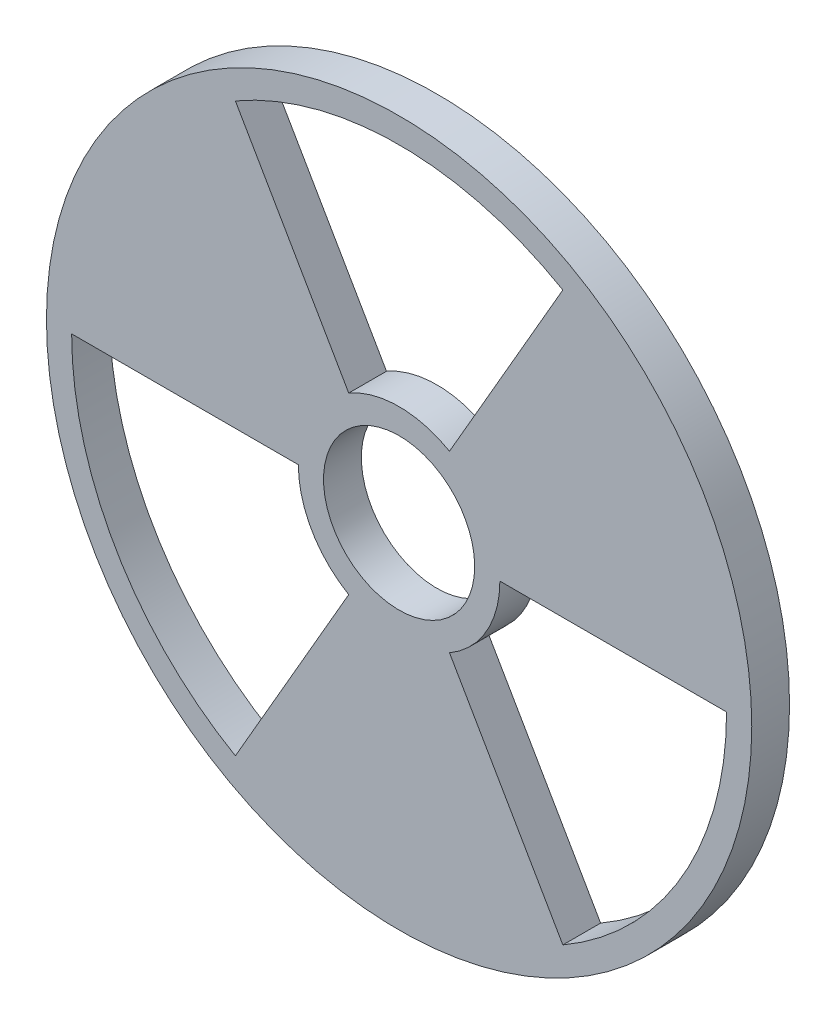
ISO-10303-21;
HEADER;
FILE_DESCRIPTION(('STEP AP214'),'2;1');
FILE_NAME('part.step','',(''),(''),'','','');
FILE_SCHEMA(('AUTOMOTIVE_DESIGN { 1 0 10303 214 1 1 1 1 }'));
ENDSEC;
DATA;
#1=APPLICATION_CONTEXT('core data for automotive mechanical design processes');
#2=APPLICATION_PROTOCOL_DEFINITION('international standard','automotive_design',2000,#1);
#3=PRODUCT_CONTEXT('',#1,'mechanical');
#4=PRODUCT('Part','Part','',(#3));
#5=PRODUCT_RELATED_PRODUCT_CATEGORY('part','',(#4));
#6=PRODUCT_DEFINITION_FORMATION('','',#4);
#7=PRODUCT_DEFINITION_CONTEXT('part definition',#1,'design');
#8=PRODUCT_DEFINITION('design','',#6,#7);
#9=PRODUCT_DEFINITION_SHAPE('','',#8);
#10=(LENGTH_UNIT() NAMED_UNIT(*) SI_UNIT(.MILLI.,.METRE.));
#11=(NAMED_UNIT(*) PLANE_ANGLE_UNIT() SI_UNIT($,.RADIAN.));
#12=(NAMED_UNIT(*) SI_UNIT($,.STERADIAN.) SOLID_ANGLE_UNIT());
#13=UNCERTAINTY_MEASURE_WITH_UNIT(LENGTH_MEASURE(1.E-05),#10,'distance_accuracy_value','');
#14=(GEOMETRIC_REPRESENTATION_CONTEXT(3) GLOBAL_UNCERTAINTY_ASSIGNED_CONTEXT((#13)) GLOBAL_UNIT_ASSIGNED_CONTEXT((#10,
#11,#12)) REPRESENTATION_CONTEXT('',''));
#15=CARTESIAN_POINT('',(0.,0.,0.));
#16=DIRECTION('',(0.,0.,1.));
#17=DIRECTION('',(1.,0.,0.));
#18=AXIS2_PLACEMENT_3D('',#15,#16,#17);
#19=CARTESIAN_POINT('',(0.,0.,3.));
#20=DIRECTION('',(0.,0.,1.));
#21=DIRECTION('',(1.,0.,0.));
#22=AXIS2_PLACEMENT_3D('',#19,#20,#21);
#23=PLANE('',#22);
#24=CARTESIAN_POINT('',(0.,0.,3.));
#25=DIRECTION('',(0.,0.,1.));
#26=DIRECTION('',(1.,0.,0.));
#27=AXIS2_PLACEMENT_3D('',#24,#25,#26);
#28=CIRCLE('',#27,28.);
#29=CARTESIAN_POINT('',(28.,0.,3.));
#30=VERTEX_POINT('',#29);
#31=EDGE_CURVE('E11',#30,#30,#28,.T.);
#32=ORIENTED_EDGE('',*,*,#31,.T.);
#33=EDGE_LOOP('',(#32));
#34=FACE_BOUND('',#33,.T.);
#35=CARTESIAN_POINT('',(0.,0.,3.));
#36=DIRECTION('',(0.,0.,1.));
#37=DIRECTION('',(1.,0.,0.));
#38=AXIS2_PLACEMENT_3D('',#35,#36,#37);
#39=CIRCLE('',#38,6.);
#40=CARTESIAN_POINT('',(6.,0.,3.));
#41=VERTEX_POINT('',#40);
#42=EDGE_CURVE('E267',#41,#41,#39,.T.);
#43=ORIENTED_EDGE('',*,*,#42,.F.);
#44=EDGE_LOOP('',(#43));
#45=FACE_BOUND('',#44,.T.);
#46=DIRECTION('',(0.500000000000001,-0.866025403784438,0.));
#47=VECTOR('',#46,1.);
#48=CARTESIAN_POINT('',(-13.,22.5166604983954,3.));
#49=LINE('',#48,#47);
#50=CARTESIAN_POINT('',(-13.,22.5166604983954,3.));
#51=VERTEX_POINT('',#50);
#52=CARTESIAN_POINT('',(-4.00000000000001,6.9282032302755,3.));
#53=VERTEX_POINT('',#52);
#54=EDGE_CURVE('E227',#51,#53,#49,.T.);
#55=ORIENTED_EDGE('',*,*,#54,.F.);
#56=CARTESIAN_POINT('',(0.,0.,3.));
#57=DIRECTION('',(0.,0.,1.));
#58=DIRECTION('',(-1.,0.,0.));
#59=AXIS2_PLACEMENT_3D('',#56,#57,#58);
#60=CIRCLE('',#59,26.);
#61=CARTESIAN_POINT('',(13.,22.5166604983954,3.));
#62=VERTEX_POINT('',#61);
#63=EDGE_CURVE('E224',#62,#51,#60,.T.);
#64=ORIENTED_EDGE('',*,*,#63,.F.);
#65=DIRECTION('',(0.500000000000001,0.866025403784438,0.));
#66=VECTOR('',#65,1.);
#67=CARTESIAN_POINT('',(13.,22.5166604983954,3.));
#68=LINE('',#67,#66);
#69=CARTESIAN_POINT('',(4.00000000000001,6.9282032302755,3.));
#70=VERTEX_POINT('',#69);
#71=EDGE_CURVE('E235',#70,#62,#68,.T.);
#72=ORIENTED_EDGE('',*,*,#71,.F.);
#73=CARTESIAN_POINT('',(0.,0.,3.));
#74=DIRECTION('',(0.,0.,-1.));
#75=DIRECTION('',(-1.,0.,0.));
#76=AXIS2_PLACEMENT_3D('',#73,#74,#75);
#77=CIRCLE('',#76,8.);
#78=EDGE_CURVE('E231',#53,#70,#77,.T.);
#79=ORIENTED_EDGE('',*,*,#78,.F.);
#80=EDGE_LOOP('',(#55,#64,#72,#79));
#81=FACE_BOUND('',#80,.T.);
#82=DIRECTION('',(-1.,0.,0.));
#83=VECTOR('',#82,1.);
#84=CARTESIAN_POINT('',(26.,0.,3.));
#85=LINE('',#84,#83);
#86=CARTESIAN_POINT('',(26.,0.,3.));
#87=VERTEX_POINT('',#86);
#88=CARTESIAN_POINT('',(7.99999999999999,0.,3.));
#89=VERTEX_POINT('',#88);
#90=EDGE_CURVE('E184',#87,#89,#85,.T.);
#91=ORIENTED_EDGE('',*,*,#90,.F.);
#92=CARTESIAN_POINT('',(0.,0.,3.));
#93=DIRECTION('',(0.,0.,1.));
#94=DIRECTION('',(-1.,0.,0.));
#95=AXIS2_PLACEMENT_3D('',#92,#93,#94);
#96=CIRCLE('',#95,26.);
#97=CARTESIAN_POINT('',(12.9999999999999,-22.5166604983955,3.));
#98=VERTEX_POINT('',#97);
#99=EDGE_CURVE('E181',#98,#87,#96,.T.);
#100=ORIENTED_EDGE('',*,*,#99,.F.);
#101=DIRECTION('',(0.499999999999998,-0.86602540378444,0.));
#102=VECTOR('',#101,1.);
#103=CARTESIAN_POINT('',(12.9999999999999,-22.5166604983955,3.));
#104=LINE('',#103,#102);
#105=CARTESIAN_POINT('',(3.99999999999994,-6.92820323027554,3.));
#106=VERTEX_POINT('',#105);
#107=EDGE_CURVE('E192',#106,#98,#104,.T.);
#108=ORIENTED_EDGE('',*,*,#107,.F.);
#109=CARTESIAN_POINT('',(0.,0.,3.));
#110=DIRECTION('',(0.,0.,-1.));
#111=DIRECTION('',(-1.,0.,0.));
#112=AXIS2_PLACEMENT_3D('',#109,#110,#111);
#113=CIRCLE('',#112,7.99999999999999);
#114=EDGE_CURVE('E188',#89,#106,#113,.T.);
#115=ORIENTED_EDGE('',*,*,#114,.F.);
#116=EDGE_LOOP('',(#91,#100,#108,#115));
#117=FACE_BOUND('',#116,.T.);
#118=DIRECTION('',(0.499999999999996,0.866025403784441,0.));
#119=VECTOR('',#118,1.);
#120=CARTESIAN_POINT('',(-12.9999999999999,-22.5166604983955,3.));
#121=LINE('',#120,#119);
#122=CARTESIAN_POINT('',(-12.9999999999999,-22.5166604983955,3.));
#123=VERTEX_POINT('',#122);
#124=CARTESIAN_POINT('',(-3.99999999999995,-6.92820323027553,3.));
#125=VERTEX_POINT('',#124);
#126=EDGE_CURVE('E142',#123,#125,#121,.T.);
#127=ORIENTED_EDGE('',*,*,#126,.F.);
#128=CARTESIAN_POINT('',(0.,0.,3.));
#129=DIRECTION('',(0.,0.,1.));
#130=DIRECTION('',(-1.,0.,0.));
#131=AXIS2_PLACEMENT_3D('',#128,#129,#130);
#132=CIRCLE('',#131,26.);
#133=CARTESIAN_POINT('',(-26.,0.,3.));
#134=VERTEX_POINT('',#133);
#135=EDGE_CURVE('E133',#134,#123,#132,.T.);
#136=ORIENTED_EDGE('',*,*,#135,.F.);
#137=DIRECTION('',(-1.,0.,0.));
#138=VECTOR('',#137,1.);
#139=CARTESIAN_POINT('',(-26.,0.,3.));
#140=LINE('',#139,#138);
#141=CARTESIAN_POINT('',(-8.,0.,3.));
#142=VERTEX_POINT('',#141);
#143=EDGE_CURVE('E159',#142,#134,#140,.T.);
#144=ORIENTED_EDGE('',*,*,#143,.F.);
#145=CARTESIAN_POINT('',(0.,0.,3.));
#146=DIRECTION('',(0.,0.,-1.));
#147=DIRECTION('',(-1.,0.,0.));
#148=AXIS2_PLACEMENT_3D('',#145,#146,#147);
#149=CIRCLE('',#148,8.);
#150=EDGE_CURVE('E155',#125,#142,#149,.T.);
#151=ORIENTED_EDGE('',*,*,#150,.F.);
#152=EDGE_LOOP('',(#127,#136,#144,#151));
#153=FACE_BOUND('',#152,.T.);
#154=ADVANCED_FACE('F43',(#34,#45,#81,#117,#153),#23,.T.);
#155=CARTESIAN_POINT('',(0.,0.,0.));
#156=DIRECTION('',(0.,0.,1.));
#157=DIRECTION('',(1.,0.,0.));
#158=AXIS2_PLACEMENT_3D('',#155,#156,#157);
#159=PLANE('',#158);
#160=CARTESIAN_POINT('',(0.,0.,0.));
#161=DIRECTION('',(0.,0.,1.));
#162=DIRECTION('',(-1.,0.,0.));
#163=AXIS2_PLACEMENT_3D('',#160,#161,#162);
#164=CIRCLE('',#163,26.);
#165=CARTESIAN_POINT('',(12.9999999999999,-22.5166604983955,0.));
#166=VERTEX_POINT('',#165);
#167=CARTESIAN_POINT('',(26.,0.,0.));
#168=VERTEX_POINT('',#167);
#169=EDGE_CURVE('E151',#166,#168,#164,.T.);
#170=ORIENTED_EDGE('',*,*,#169,.T.);
#171=DIRECTION('',(-1.,0.,0.));
#172=VECTOR('',#171,1.);
#173=CARTESIAN_POINT('',(26.,0.,0.));
#174=LINE('',#173,#172);
#175=CARTESIAN_POINT('',(7.99999999999999,0.,0.));
#176=VERTEX_POINT('',#175);
#177=EDGE_CURVE('E199',#168,#176,#174,.T.);
#178=ORIENTED_EDGE('',*,*,#177,.T.);
#179=CARTESIAN_POINT('',(0.,0.,0.));
#180=DIRECTION('',(0.,0.,-1.));
#181=DIRECTION('',(-1.,0.,0.));
#182=AXIS2_PLACEMENT_3D('',#179,#180,#181);
#183=CIRCLE('',#182,7.99999999999999);
#184=CARTESIAN_POINT('',(3.99999999999994,-6.92820323027554,0.));
#185=VERTEX_POINT('',#184);
#186=EDGE_CURVE('E203',#176,#185,#183,.T.);
#187=ORIENTED_EDGE('',*,*,#186,.T.);
#188=DIRECTION('',(0.499999999999998,-0.86602540378444,0.));
#189=VECTOR('',#188,1.);
#190=CARTESIAN_POINT('',(12.9999999999999,-22.5166604983955,0.));
#191=LINE('',#190,#189);
#192=EDGE_CURVE('E185',#185,#166,#191,.T.);
#193=ORIENTED_EDGE('',*,*,#192,.T.);
#194=EDGE_LOOP('',(#170,#178,#187,#193));
#195=FACE_BOUND('',#194,.T.);
#196=CARTESIAN_POINT('',(0.,0.,0.));
#197=DIRECTION('',(0.,0.,1.));
#198=DIRECTION('',(1.,0.,0.));
#199=AXIS2_PLACEMENT_3D('',#196,#197,#198);
#200=CIRCLE('',#199,6.);
#201=CARTESIAN_POINT('',(6.,0.,0.));
#202=VERTEX_POINT('',#201);
#203=EDGE_CURVE('E266',#202,#202,#200,.T.);
#204=ORIENTED_EDGE('',*,*,#203,.T.);
#205=EDGE_LOOP('',(#204));
#206=FACE_BOUND('',#205,.T.);
#207=CARTESIAN_POINT('',(0.,0.,0.));
#208=DIRECTION('',(0.,0.,1.));
#209=DIRECTION('',(1.,0.,0.));
#210=AXIS2_PLACEMENT_3D('',#207,#208,#209);
#211=CIRCLE('',#210,28.);
#212=CARTESIAN_POINT('',(28.,0.,0.));
#213=VERTEX_POINT('',#212);
#214=EDGE_CURVE('E47',#213,#213,#211,.T.);
#215=ORIENTED_EDGE('',*,*,#214,.F.);
#216=EDGE_LOOP('',(#215));
#217=FACE_BOUND('',#216,.T.);
#218=CARTESIAN_POINT('',(0.,0.,0.));
#219=DIRECTION('',(0.,0.,1.));
#220=DIRECTION('',(-1.,0.,0.));
#221=AXIS2_PLACEMENT_3D('',#218,#219,#220);
#222=CIRCLE('',#221,26.);
#223=CARTESIAN_POINT('',(13.,22.5166604983954,0.));
#224=VERTEX_POINT('',#223);
#225=CARTESIAN_POINT('',(-13.,22.5166604983954,0.));
#226=VERTEX_POINT('',#225);
#227=EDGE_CURVE('E223',#224,#226,#222,.T.);
#228=ORIENTED_EDGE('',*,*,#227,.T.);
#229=DIRECTION('',(0.500000000000001,-0.866025403784438,0.));
#230=VECTOR('',#229,1.);
#231=CARTESIAN_POINT('',(-13.,22.5166604983954,0.));
#232=LINE('',#231,#230);
#233=CARTESIAN_POINT('',(-4.00000000000001,6.9282032302755,0.));
#234=VERTEX_POINT('',#233);
#235=EDGE_CURVE('E242',#226,#234,#232,.T.);
#236=ORIENTED_EDGE('',*,*,#235,.T.);
#237=CARTESIAN_POINT('',(0.,0.,0.));
#238=DIRECTION('',(0.,0.,-1.));
#239=DIRECTION('',(-1.,0.,0.));
#240=AXIS2_PLACEMENT_3D('',#237,#238,#239);
#241=CIRCLE('',#240,8.);
#242=CARTESIAN_POINT('',(4.00000000000001,6.9282032302755,0.));
#243=VERTEX_POINT('',#242);
#244=EDGE_CURVE('E246',#234,#243,#241,.T.);
#245=ORIENTED_EDGE('',*,*,#244,.T.);
#246=DIRECTION('',(0.500000000000001,0.866025403784438,0.));
#247=VECTOR('',#246,1.);
#248=CARTESIAN_POINT('',(13.,22.5166604983954,0.));
#249=LINE('',#248,#247);
#250=EDGE_CURVE('E228',#243,#224,#249,.T.);
#251=ORIENTED_EDGE('',*,*,#250,.T.);
#252=EDGE_LOOP('',(#228,#236,#245,#251));
#253=FACE_BOUND('',#252,.T.);
#254=CARTESIAN_POINT('',(0.,0.,0.));
#255=DIRECTION('',(0.,0.,1.));
#256=DIRECTION('',(-1.,0.,0.));
#257=AXIS2_PLACEMENT_3D('',#254,#255,#256);
#258=CIRCLE('',#257,26.);
#259=CARTESIAN_POINT('',(-26.,0.,0.));
#260=VERTEX_POINT('',#259);
#261=CARTESIAN_POINT('',(-12.9999999999999,-22.5166604983955,0.));
#262=VERTEX_POINT('',#261);
#263=EDGE_CURVE('E67',#260,#262,#258,.T.);
#264=ORIENTED_EDGE('',*,*,#263,.T.);
#265=DIRECTION('',(0.499999999999996,0.866025403784441,0.));
#266=VECTOR('',#265,1.);
#267=CARTESIAN_POINT('',(-12.9999999999999,-22.5166604983955,0.));
#268=LINE('',#267,#266);
#269=CARTESIAN_POINT('',(-3.99999999999995,-6.92820323027553,0.));
#270=VERTEX_POINT('',#269);
#271=EDGE_CURVE('E149',#262,#270,#268,.T.);
#272=ORIENTED_EDGE('',*,*,#271,.T.);
#273=CARTESIAN_POINT('',(0.,0.,0.));
#274=DIRECTION('',(0.,0.,-1.));
#275=DIRECTION('',(-1.,0.,0.));
#276=AXIS2_PLACEMENT_3D('',#273,#274,#275);
#277=CIRCLE('',#276,8.);
#278=CARTESIAN_POINT('',(-8.,0.,0.));
#279=VERTEX_POINT('',#278);
#280=EDGE_CURVE('E168',#270,#279,#277,.T.);
#281=ORIENTED_EDGE('',*,*,#280,.T.);
#282=DIRECTION('',(-1.,0.,0.));
#283=VECTOR('',#282,1.);
#284=CARTESIAN_POINT('',(-26.,0.,0.));
#285=LINE('',#284,#283);
#286=EDGE_CURVE('E143',#279,#260,#285,.T.);
#287=ORIENTED_EDGE('',*,*,#286,.T.);
#288=EDGE_LOOP('',(#264,#272,#281,#287));
#289=FACE_BOUND('',#288,.T.);
#290=ADVANCED_FACE('F275',(#195,#206,#217,#253,#289),#159,.F.);
#291=CARTESIAN_POINT('',(0.,0.,3.));
#292=DIRECTION('',(0.,0.,-1.));
#293=DIRECTION('',(-1.,0.,0.));
#294=AXIS2_PLACEMENT_3D('',#291,#292,#293);
#295=CYLINDRICAL_SURFACE('',#294,28.);
#296=ORIENTED_EDGE('',*,*,#31,.F.);
#297=EDGE_LOOP('',(#296));
#298=FACE_BOUND('',#297,.T.);
#299=ORIENTED_EDGE('',*,*,#214,.T.);
#300=EDGE_LOOP('',(#299));
#301=FACE_BOUND('',#300,.T.);
#302=ADVANCED_FACE('F45',(#298,#301),#295,.T.);
#303=CARTESIAN_POINT('',(0.,0.,3.));
#304=DIRECTION('',(0.,0.,-1.));
#305=DIRECTION('',(-1.,0.,0.));
#306=AXIS2_PLACEMENT_3D('',#303,#304,#305);
#307=CYLINDRICAL_SURFACE('',#306,6.);
#308=ORIENTED_EDGE('',*,*,#42,.T.);
#309=EDGE_LOOP('',(#308));
#310=FACE_BOUND('',#309,.T.);
#311=ORIENTED_EDGE('',*,*,#203,.F.);
#312=EDGE_LOOP('',(#311));
#313=FACE_BOUND('',#312,.T.);
#314=ADVANCED_FACE('F278',(#310,#313),#307,.F.);
#315=CARTESIAN_POINT('',(0.,0.,3.));
#316=DIRECTION('',(0.,0.,-1.));
#317=DIRECTION('',(-1.,0.,0.));
#318=AXIS2_PLACEMENT_3D('',#315,#316,#317);
#319=CYLINDRICAL_SURFACE('',#318,26.);
#320=ORIENTED_EDGE('',*,*,#227,.F.);
#321=DIRECTION('',(0.,0.,-1.));
#322=VECTOR('',#321,1.);
#323=CARTESIAN_POINT('',(13.,22.5166604983954,3.));
#324=LINE('',#323,#322);
#325=EDGE_CURVE('E238',#62,#224,#324,.T.);
#326=ORIENTED_EDGE('',*,*,#325,.F.);
#327=ORIENTED_EDGE('',*,*,#63,.T.);
#328=DIRECTION('',(0.,0.,-1.));
#329=VECTOR('',#328,1.);
#330=CARTESIAN_POINT('',(-13.,22.5166604983954,3.));
#331=LINE('',#330,#329);
#332=EDGE_CURVE('E262',#51,#226,#331,.T.);
#333=ORIENTED_EDGE('',*,*,#332,.T.);
#334=EDGE_LOOP('',(#320,#326,#327,#333));
#335=FACE_BOUND('',#334,.T.);
#336=ADVANCED_FACE('F280',(#335),#319,.F.);
#337=CARTESIAN_POINT('',(-13.,22.5166604983954,3.));
#338=DIRECTION('',(0.866025403784438,0.500000000000001,0.));
#339=DIRECTION('',(-0.500000000000001,0.866025403784438,0.));
#340=AXIS2_PLACEMENT_3D('',#337,#338,#339);
#341=PLANE('',#340);
#342=ORIENTED_EDGE('',*,*,#235,.F.);
#343=ORIENTED_EDGE('',*,*,#332,.F.);
#344=ORIENTED_EDGE('',*,*,#54,.T.);
#345=DIRECTION('',(0.,0.,-1.));
#346=VECTOR('',#345,1.);
#347=CARTESIAN_POINT('',(-4.00000000000001,6.9282032302755,3.));
#348=LINE('',#347,#346);
#349=EDGE_CURVE('E259',#53,#234,#348,.T.);
#350=ORIENTED_EDGE('',*,*,#349,.T.);
#351=EDGE_LOOP('',(#342,#343,#344,#350));
#352=FACE_BOUND('',#351,.T.);
#353=ADVANCED_FACE('F287',(#352),#341,.T.);
#354=CARTESIAN_POINT('',(0.,0.,3.));
#355=DIRECTION('',(0.,0.,-1.));
#356=DIRECTION('',(-1.,0.,0.));
#357=AXIS2_PLACEMENT_3D('',#354,#355,#356);
#358=CYLINDRICAL_SURFACE('',#357,8.);
#359=ORIENTED_EDGE('',*,*,#244,.F.);
#360=ORIENTED_EDGE('',*,*,#349,.F.);
#361=ORIENTED_EDGE('',*,*,#78,.T.);
#362=DIRECTION('',(0.,0.,-1.));
#363=VECTOR('',#362,1.);
#364=CARTESIAN_POINT('',(4.00000000000001,6.9282032302755,3.));
#365=LINE('',#364,#363);
#366=EDGE_CURVE('E256',#70,#243,#365,.T.);
#367=ORIENTED_EDGE('',*,*,#366,.T.);
#368=EDGE_LOOP('',(#359,#360,#361,#367));
#369=FACE_BOUND('',#368,.T.);
#370=ADVANCED_FACE('F340',(#369),#358,.T.);
#371=CARTESIAN_POINT('',(13.,22.5166604983954,3.));
#372=DIRECTION('',(-0.866025403784438,0.500000000000001,0.));
#373=DIRECTION('',(-0.500000000000001,-0.866025403784438,0.));
#374=AXIS2_PLACEMENT_3D('',#371,#372,#373);
#375=PLANE('',#374);
#376=ORIENTED_EDGE('',*,*,#250,.F.);
#377=ORIENTED_EDGE('',*,*,#366,.F.);
#378=ORIENTED_EDGE('',*,*,#71,.T.);
#379=ORIENTED_EDGE('',*,*,#325,.T.);
#380=EDGE_LOOP('',(#376,#377,#378,#379));
#381=FACE_BOUND('',#380,.T.);
#382=ADVANCED_FACE('F337',(#381),#375,.T.);
#383=CARTESIAN_POINT('',(0.,0.,3.));
#384=DIRECTION('',(0.,0.,-1.));
#385=DIRECTION('',(-1.,0.,0.));
#386=AXIS2_PLACEMENT_3D('',#383,#384,#385);
#387=CYLINDRICAL_SURFACE('',#386,26.);
#388=ORIENTED_EDGE('',*,*,#169,.F.);
#389=DIRECTION('',(0.,0.,-1.));
#390=VECTOR('',#389,1.);
#391=CARTESIAN_POINT('',(12.9999999999999,-22.5166604983955,3.));
#392=LINE('',#391,#390);
#393=EDGE_CURVE('E195',#98,#166,#392,.T.);
#394=ORIENTED_EDGE('',*,*,#393,.F.);
#395=ORIENTED_EDGE('',*,*,#99,.T.);
#396=DIRECTION('',(0.,0.,-1.));
#397=VECTOR('',#396,1.);
#398=CARTESIAN_POINT('',(26.,0.,3.));
#399=LINE('',#398,#397);
#400=EDGE_CURVE('E219',#87,#168,#399,.T.);
#401=ORIENTED_EDGE('',*,*,#400,.T.);
#402=EDGE_LOOP('',(#388,#394,#395,#401));
#403=FACE_BOUND('',#402,.T.);
#404=ADVANCED_FACE('F319',(#403),#387,.F.);
#405=CARTESIAN_POINT('',(26.,0.,3.));
#406=DIRECTION('',(0.,-1.,0.));
#407=DIRECTION('',(1.,0.,0.));
#408=AXIS2_PLACEMENT_3D('',#405,#406,#407);
#409=PLANE('',#408);
#410=ORIENTED_EDGE('',*,*,#177,.F.);
#411=ORIENTED_EDGE('',*,*,#400,.F.);
#412=ORIENTED_EDGE('',*,*,#90,.T.);
#413=DIRECTION('',(0.,0.,-1.));
#414=VECTOR('',#413,1.);
#415=CARTESIAN_POINT('',(7.99999999999999,0.,3.));
#416=LINE('',#415,#414);
#417=EDGE_CURVE('E216',#89,#176,#416,.T.);
#418=ORIENTED_EDGE('',*,*,#417,.T.);
#419=EDGE_LOOP('',(#410,#411,#412,#418));
#420=FACE_BOUND('',#419,.T.);
#421=ADVANCED_FACE('F313',(#420),#409,.T.);
#422=CARTESIAN_POINT('',(0.,0.,3.));
#423=DIRECTION('',(0.,0.,-1.));
#424=DIRECTION('',(-1.,0.,0.));
#425=AXIS2_PLACEMENT_3D('',#422,#423,#424);
#426=CYLINDRICAL_SURFACE('',#425,7.99999999999999);
#427=ORIENTED_EDGE('',*,*,#186,.F.);
#428=ORIENTED_EDGE('',*,*,#417,.F.);
#429=ORIENTED_EDGE('',*,*,#114,.T.);
#430=DIRECTION('',(0.,0.,-1.));
#431=VECTOR('',#430,1.);
#432=CARTESIAN_POINT('',(3.99999999999994,-6.92820323027554,3.));
#433=LINE('',#432,#431);
#434=EDGE_CURVE('E213',#106,#185,#433,.T.);
#435=ORIENTED_EDGE('',*,*,#434,.T.);
#436=EDGE_LOOP('',(#427,#428,#429,#435));
#437=FACE_BOUND('',#436,.T.);
#438=ADVANCED_FACE('F316',(#437),#426,.T.);
#439=CARTESIAN_POINT('',(12.9999999999999,-22.5166604983955,3.));
#440=DIRECTION('',(0.86602540378444,0.499999999999998,0.));
#441=DIRECTION('',(-0.499999999999998,0.86602540378444,0.));
#442=AXIS2_PLACEMENT_3D('',#439,#440,#441);
#443=PLANE('',#442);
#444=ORIENTED_EDGE('',*,*,#192,.F.);
#445=ORIENTED_EDGE('',*,*,#434,.F.);
#446=ORIENTED_EDGE('',*,*,#107,.T.);
#447=ORIENTED_EDGE('',*,*,#393,.T.);
#448=EDGE_LOOP('',(#444,#445,#446,#447));
#449=FACE_BOUND('',#448,.T.);
#450=ADVANCED_FACE('F322',(#449),#443,.T.);
#451=CARTESIAN_POINT('',(0.,0.,3.));
#452=DIRECTION('',(0.,0.,-1.));
#453=DIRECTION('',(-1.,0.,0.));
#454=AXIS2_PLACEMENT_3D('',#451,#452,#453);
#455=CYLINDRICAL_SURFACE('',#454,26.);
#456=ORIENTED_EDGE('',*,*,#263,.F.);
#457=DIRECTION('',(0.,0.,-1.));
#458=VECTOR('',#457,1.);
#459=CARTESIAN_POINT('',(-26.,0.,3.));
#460=LINE('',#459,#458);
#461=EDGE_CURVE('E137',#134,#260,#460,.T.);
#462=ORIENTED_EDGE('',*,*,#461,.F.);
#463=ORIENTED_EDGE('',*,*,#135,.T.);
#464=DIRECTION('',(0.,0.,-1.));
#465=VECTOR('',#464,1.);
#466=CARTESIAN_POINT('',(-12.9999999999999,-22.5166604983955,3.));
#467=LINE('',#466,#465);
#468=EDGE_CURVE('E136',#123,#262,#467,.T.);
#469=ORIENTED_EDGE('',*,*,#468,.T.);
#470=EDGE_LOOP('',(#456,#462,#463,#469));
#471=FACE_BOUND('',#470,.T.);
#472=ADVANCED_FACE('F135',(#471),#455,.F.);
#473=CARTESIAN_POINT('',(-12.9999999999999,-22.5166604983955,3.));
#474=DIRECTION('',(-0.866025403784441,0.499999999999996,0.));
#475=DIRECTION('',(-0.499999999999996,-0.866025403784441,0.));
#476=AXIS2_PLACEMENT_3D('',#473,#474,#475);
#477=PLANE('',#476);
#478=ORIENTED_EDGE('',*,*,#271,.F.);
#479=ORIENTED_EDGE('',*,*,#468,.F.);
#480=ORIENTED_EDGE('',*,*,#126,.T.);
#481=DIRECTION('',(0.,0.,-1.));
#482=VECTOR('',#481,1.);
#483=CARTESIAN_POINT('',(-3.99999999999995,-6.92820323027553,3.));
#484=LINE('',#483,#482);
#485=EDGE_CURVE('E152',#125,#270,#484,.T.);
#486=ORIENTED_EDGE('',*,*,#485,.T.);
#487=EDGE_LOOP('',(#478,#479,#480,#486));
#488=FACE_BOUND('',#487,.T.);
#489=ADVANCED_FACE('F146',(#488),#477,.T.);
#490=CARTESIAN_POINT('',(0.,0.,3.));
#491=DIRECTION('',(0.,0.,-1.));
#492=DIRECTION('',(-1.,0.,0.));
#493=AXIS2_PLACEMENT_3D('',#490,#491,#492);
#494=CYLINDRICAL_SURFACE('',#493,8.);
#495=ORIENTED_EDGE('',*,*,#280,.F.);
#496=ORIENTED_EDGE('',*,*,#485,.F.);
#497=ORIENTED_EDGE('',*,*,#150,.T.);
#498=DIRECTION('',(0.,0.,-1.));
#499=VECTOR('',#498,1.);
#500=CARTESIAN_POINT('',(-8.,0.,3.));
#501=LINE('',#500,#499);
#502=EDGE_CURVE('E59',#142,#279,#501,.T.);
#503=ORIENTED_EDGE('',*,*,#502,.T.);
#504=EDGE_LOOP('',(#495,#496,#497,#503));
#505=FACE_BOUND('',#504,.T.);
#506=ADVANCED_FACE('F360',(#505),#494,.T.);
#507=CARTESIAN_POINT('',(-26.,0.,3.));
#508=DIRECTION('',(0.,-1.,0.));
#509=DIRECTION('',(1.,0.,0.));
#510=AXIS2_PLACEMENT_3D('',#507,#508,#509);
#511=PLANE('',#510);
#512=ORIENTED_EDGE('',*,*,#286,.F.);
#513=ORIENTED_EDGE('',*,*,#502,.F.);
#514=ORIENTED_EDGE('',*,*,#143,.T.);
#515=ORIENTED_EDGE('',*,*,#461,.T.);
#516=EDGE_LOOP('',(#512,#513,#514,#515));
#517=FACE_BOUND('',#516,.T.);
#518=ADVANCED_FACE('F358',(#517),#511,.T.);
#519=CLOSED_SHELL('',(#154,#290,#302,#314,#336,#353,#370,#382,#404,#421,#438,#450,#472,#489,
#506,#518));
#520=MANIFOLD_SOLID_BREP('B2',#519);
#521=ADVANCED_BREP_SHAPE_REPRESENTATION('',(#18,#520),#14);
#522=SHAPE_DEFINITION_REPRESENTATION(#9,#521);
ENDSEC;
END-ISO-10303-21;
